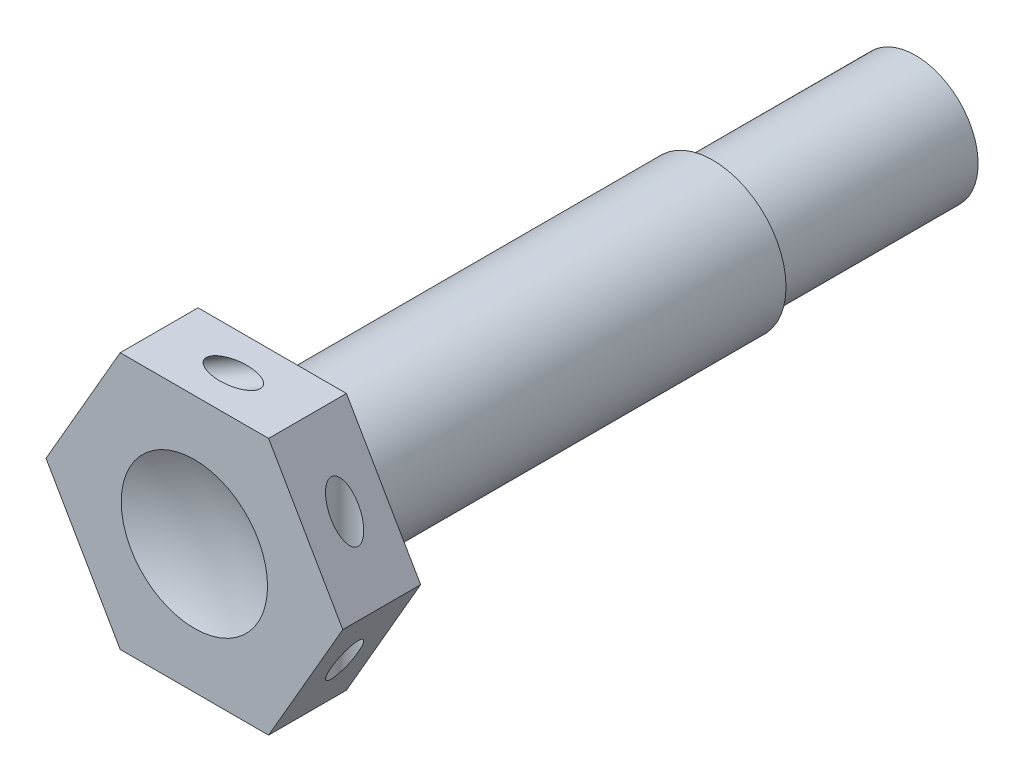
ISO-10303-21;
HEADER;
FILE_DESCRIPTION(('STEP AP214'),'2;1');
FILE_NAME('part.step','',(''),(''),'','','');
FILE_SCHEMA(('AUTOMOTIVE_DESIGN { 1 0 10303 214 1 1 1 1 }'));
ENDSEC;
DATA;
#1=APPLICATION_CONTEXT('core data for automotive mechanical design processes');
#2=APPLICATION_PROTOCOL_DEFINITION('international standard','automotive_design',2000,#1);
#3=PRODUCT_CONTEXT('',#1,'mechanical');
#4=PRODUCT('Part','Part','',(#3));
#5=PRODUCT_RELATED_PRODUCT_CATEGORY('part','',(#4));
#6=PRODUCT_DEFINITION_FORMATION('','',#4);
#7=PRODUCT_DEFINITION_CONTEXT('part definition',#1,'design');
#8=PRODUCT_DEFINITION('design','',#6,#7);
#9=PRODUCT_DEFINITION_SHAPE('','',#8);
#10=(LENGTH_UNIT() NAMED_UNIT(*) SI_UNIT(.MILLI.,.METRE.));
#11=(NAMED_UNIT(*) PLANE_ANGLE_UNIT() SI_UNIT($,.RADIAN.));
#12=(NAMED_UNIT(*) SI_UNIT($,.STERADIAN.) SOLID_ANGLE_UNIT());
#13=UNCERTAINTY_MEASURE_WITH_UNIT(LENGTH_MEASURE(1.E-05),#10,'distance_accuracy_value','');
#14=(GEOMETRIC_REPRESENTATION_CONTEXT(3) GLOBAL_UNCERTAINTY_ASSIGNED_CONTEXT((#13)) GLOBAL_UNIT_ASSIGNED_CONTEXT((#10,
#11,#12)) REPRESENTATION_CONTEXT('',''));
#15=CARTESIAN_POINT('',(0.,0.,0.));
#16=DIRECTION('',(0.,0.,1.));
#17=DIRECTION('',(1.,0.,0.));
#18=AXIS2_PLACEMENT_3D('',#15,#16,#17);
#19=CARTESIAN_POINT('',(6.41580486636972,0.,3.3655));
#20=DIRECTION('',(-0.866025403784438,-0.5,0.));
#21=DIRECTION('',(0.5,-0.866025403784439,0.));
#22=AXIS2_PLACEMENT_3D('',#19,#20,#21);
#23=PLANE('',#22);
#24=CARTESIAN_POINT('',(4.81185364977729,2.778125,1.68275));
#25=DIRECTION('',(-0.866025403784438,-0.5,0.));
#26=DIRECTION('',(-0.5,0.866025403784439,0.));
#27=AXIS2_PLACEMENT_3D('',#24,#25,#26);
#28=ELLIPSE('',#27,1.1684,0.5842);
#29=CARTESIAN_POINT('',(4.22765364977729,3.78998908178174,1.68275));
#30=VERTEX_POINT('',#29);
#31=EDGE_CURVE('E143',#30,#30,#28,.T.);
#32=ORIENTED_EDGE('',*,*,#31,.T.);
#33=EDGE_LOOP('',(#32));
#34=FACE_BOUND('',#33,.T.);
#35=DIRECTION('',(-0.5,0.866025403784438,0.));
#36=VECTOR('',#35,1.);
#37=CARTESIAN_POINT('',(6.41580486636972,0.,0.));
#38=LINE('',#37,#36);
#39=CARTESIAN_POINT('',(6.41580486636972,0.,0.));
#40=VERTEX_POINT('',#39);
#41=CARTESIAN_POINT('',(3.20790243318486,5.55625,0.));
#42=VERTEX_POINT('',#41);
#43=EDGE_CURVE('E122',#40,#42,#38,.T.);
#44=ORIENTED_EDGE('',*,*,#43,.T.);
#45=DIRECTION('',(0.,0.,-1.));
#46=VECTOR('',#45,1.);
#47=CARTESIAN_POINT('',(3.20790243318486,5.55625,3.3655));
#48=LINE('',#47,#46);
#49=CARTESIAN_POINT('',(3.20790243318486,5.55625,3.3655));
#50=VERTEX_POINT('',#49);
#51=EDGE_CURVE('E44',#50,#42,#48,.T.);
#52=ORIENTED_EDGE('',*,*,#51,.F.);
#53=DIRECTION('',(-0.5,0.866025403784438,0.));
#54=VECTOR('',#53,1.);
#55=CARTESIAN_POINT('',(6.41580486636972,0.,3.3655));
#56=LINE('',#55,#54);
#57=CARTESIAN_POINT('',(6.41580486636972,0.,3.3655));
#58=VERTEX_POINT('',#57);
#59=EDGE_CURVE('E133',#58,#50,#56,.T.);
#60=ORIENTED_EDGE('',*,*,#59,.F.);
#61=DIRECTION('',(0.,0.,-1.));
#62=VECTOR('',#61,1.);
#63=CARTESIAN_POINT('',(6.41580486636972,0.,3.3655));
#64=LINE('',#63,#62);
#65=EDGE_CURVE('E118',#58,#40,#64,.T.);
#66=ORIENTED_EDGE('',*,*,#65,.T.);
#67=EDGE_LOOP('',(#44,#52,#60,#66));
#68=FACE_BOUND('',#67,.T.);
#69=ADVANCED_FACE('F35',(#34,#68),#23,.F.);
#70=CARTESIAN_POINT('',(3.20790243318486,5.55625,3.3655));
#71=DIRECTION('',(0.,-1.,0.));
#72=DIRECTION('',(0.,0.,-1.));
#73=AXIS2_PLACEMENT_3D('',#70,#71,#72);
#74=PLANE('',#73);
#75=CARTESIAN_POINT('',(0.,5.55625,1.68275));
#76=DIRECTION('',(0.,-1.,0.));
#77=DIRECTION('',(-1.,0.,0.));
#78=AXIS2_PLACEMENT_3D('',#75,#76,#77);
#79=ELLIPSE('',#78,1.16839999999999,0.5842);
#80=CARTESIAN_POINT('',(-1.16840000000001,5.55625,1.68275));
#81=VERTEX_POINT('',#80);
#82=EDGE_CURVE('E144',#81,#81,#79,.T.);
#83=ORIENTED_EDGE('',*,*,#82,.T.);
#84=EDGE_LOOP('',(#83));
#85=FACE_BOUND('',#84,.T.);
#86=DIRECTION('',(-1.,0.,0.));
#87=VECTOR('',#86,1.);
#88=CARTESIAN_POINT('',(3.20790243318486,5.55625,0.));
#89=LINE('',#88,#87);
#90=CARTESIAN_POINT('',(-3.20790243318486,5.55625,0.));
#91=VERTEX_POINT('',#90);
#92=EDGE_CURVE('E125',#42,#91,#89,.T.);
#93=ORIENTED_EDGE('',*,*,#92,.T.);
#94=DIRECTION('',(0.,0.,-1.));
#95=VECTOR('',#94,1.);
#96=CARTESIAN_POINT('',(-3.20790243318486,5.55625,3.3655));
#97=LINE('',#96,#95);
#98=CARTESIAN_POINT('',(-3.20790243318486,5.55625,3.3655));
#99=VERTEX_POINT('',#98);
#100=EDGE_CURVE('E137',#99,#91,#97,.T.);
#101=ORIENTED_EDGE('',*,*,#100,.F.);
#102=DIRECTION('',(-1.,0.,0.));
#103=VECTOR('',#102,1.);
#104=CARTESIAN_POINT('',(3.20790243318486,5.55625,3.3655));
#105=LINE('',#104,#103);
#106=EDGE_CURVE('E91',#50,#99,#105,.T.);
#107=ORIENTED_EDGE('',*,*,#106,.F.);
#108=ORIENTED_EDGE('',*,*,#51,.T.);
#109=EDGE_LOOP('',(#93,#101,#107,#108));
#110=FACE_BOUND('',#109,.T.);
#111=ADVANCED_FACE('F174',(#85,#110),#74,.F.);
#112=CARTESIAN_POINT('',(-3.20790243318486,5.55625,3.3655));
#113=DIRECTION('',(0.866025403784439,-0.499999999999999,0.));
#114=DIRECTION('',(0.499999999999999,0.866025403784439,0.));
#115=AXIS2_PLACEMENT_3D('',#112,#113,#114);
#116=PLANE('',#115);
#117=CARTESIAN_POINT('',(-4.8118536497773,2.77812499999997,1.68275));
#118=DIRECTION('',(0.866025403784439,-0.499999999999999,0.));
#119=DIRECTION('',(-0.499999999999999,-0.866025403784439,0.));
#120=AXIS2_PLACEMENT_3D('',#117,#118,#119);
#121=ELLIPSE('',#120,1.16840000000001,0.5842);
#122=CARTESIAN_POINT('',(-5.39605364977731,1.76626091821823,1.68275));
#123=VERTEX_POINT('',#122);
#124=EDGE_CURVE('E38',#123,#123,#121,.T.);
#125=ORIENTED_EDGE('',*,*,#124,.T.);
#126=EDGE_LOOP('',(#125));
#127=FACE_BOUND('',#126,.T.);
#128=DIRECTION('',(-0.499999999999999,-0.866025403784439,0.));
#129=VECTOR('',#128,1.);
#130=CARTESIAN_POINT('',(-3.20790243318486,5.55625,0.));
#131=LINE('',#130,#129);
#132=CARTESIAN_POINT('',(-6.41580486636972,0.,0.));
#133=VERTEX_POINT('',#132);
#134=EDGE_CURVE('E128',#91,#133,#131,.T.);
#135=ORIENTED_EDGE('',*,*,#134,.T.);
#136=DIRECTION('',(0.,0.,-1.));
#137=VECTOR('',#136,1.);
#138=CARTESIAN_POINT('',(-6.41580486636972,0.,3.3655));
#139=LINE('',#138,#137);
#140=CARTESIAN_POINT('',(-6.41580486636972,0.,3.3655));
#141=VERTEX_POINT('',#140);
#142=EDGE_CURVE('E113',#141,#133,#139,.T.);
#143=ORIENTED_EDGE('',*,*,#142,.F.);
#144=DIRECTION('',(-0.499999999999999,-0.866025403784439,0.));
#145=VECTOR('',#144,1.);
#146=CARTESIAN_POINT('',(-3.20790243318486,5.55625,3.3655));
#147=LINE('',#146,#145);
#148=EDGE_CURVE('E104',#99,#141,#147,.T.);
#149=ORIENTED_EDGE('',*,*,#148,.F.);
#150=ORIENTED_EDGE('',*,*,#100,.T.);
#151=EDGE_LOOP('',(#135,#143,#149,#150));
#152=FACE_BOUND('',#151,.T.);
#153=ADVANCED_FACE('F177',(#127,#152),#116,.F.);
#154=CARTESIAN_POINT('',(-6.41580486636972,0.,3.3655));
#155=DIRECTION('',(0.866025403784438,0.5,0.));
#156=DIRECTION('',(-0.5,0.866025403784438,0.));
#157=AXIS2_PLACEMENT_3D('',#154,#155,#156);
#158=PLANE('',#157);
#159=CARTESIAN_POINT('',(-4.81185364977726,-2.77812500000004,1.68275));
#160=DIRECTION('',(0.866025403784438,0.5,0.));
#161=DIRECTION('',(0.5,-0.866025403784438,0.));
#162=AXIS2_PLACEMENT_3D('',#159,#160,#161);
#163=ELLIPSE('',#162,1.16839999999998,0.5842);
#164=CARTESIAN_POINT('',(-4.22765364977727,-3.78998908178176,1.68275));
#165=VERTEX_POINT('',#164);
#166=EDGE_CURVE('E147',#165,#165,#163,.T.);
#167=ORIENTED_EDGE('',*,*,#166,.T.);
#168=EDGE_LOOP('',(#167));
#169=FACE_BOUND('',#168,.T.);
#170=DIRECTION('',(0.5,-0.866025403784438,0.));
#171=VECTOR('',#170,1.);
#172=CARTESIAN_POINT('',(-6.41580486636972,0.,0.));
#173=LINE('',#172,#171);
#174=CARTESIAN_POINT('',(-3.20790243318486,-5.55625,0.));
#175=VERTEX_POINT('',#174);
#176=EDGE_CURVE('E112',#133,#175,#173,.T.);
#177=ORIENTED_EDGE('',*,*,#176,.T.);
#178=DIRECTION('',(0.,0.,-1.));
#179=VECTOR('',#178,1.);
#180=CARTESIAN_POINT('',(-3.20790243318486,-5.55625,3.3655));
#181=LINE('',#180,#179);
#182=CARTESIAN_POINT('',(-3.20790243318486,-5.55625,3.3655));
#183=VERTEX_POINT('',#182);
#184=EDGE_CURVE('E109',#183,#175,#181,.T.);
#185=ORIENTED_EDGE('',*,*,#184,.F.);
#186=DIRECTION('',(0.5,-0.866025403784438,0.));
#187=VECTOR('',#186,1.);
#188=CARTESIAN_POINT('',(-6.41580486636972,0.,3.3655));
#189=LINE('',#188,#187);
#190=EDGE_CURVE('E98',#141,#183,#189,.T.);
#191=ORIENTED_EDGE('',*,*,#190,.F.);
#192=ORIENTED_EDGE('',*,*,#142,.T.);
#193=EDGE_LOOP('',(#177,#185,#191,#192));
#194=FACE_BOUND('',#193,.T.);
#195=ADVANCED_FACE('F110',(#169,#194),#158,.F.);
#196=CARTESIAN_POINT('',(-3.20790243318486,-5.55625,3.3655));
#197=DIRECTION('',(0.,1.,0.));
#198=DIRECTION('',(-1.,0.,0.));
#199=AXIS2_PLACEMENT_3D('',#196,#197,#198);
#200=PLANE('',#199);
#201=CARTESIAN_POINT('',(0.,-5.55625,1.68275));
#202=DIRECTION('',(0.,1.,0.));
#203=DIRECTION('',(1.,0.,0.));
#204=AXIS2_PLACEMENT_3D('',#201,#202,#203);
#205=ELLIPSE('',#204,1.16840000000002,0.5842);
#206=CARTESIAN_POINT('',(1.16840000000008,-5.55625,1.68275));
#207=VERTEX_POINT('',#206);
#208=EDGE_CURVE('E145',#207,#207,#205,.T.);
#209=ORIENTED_EDGE('',*,*,#208,.T.);
#210=EDGE_LOOP('',(#209));
#211=FACE_BOUND('',#210,.T.);
#212=DIRECTION('',(1.,0.,0.));
#213=VECTOR('',#212,1.);
#214=CARTESIAN_POINT('',(-3.20790243318486,-5.55625,0.));
#215=LINE('',#214,#213);
#216=CARTESIAN_POINT('',(3.20790243318486,-5.55625,0.));
#217=VERTEX_POINT('',#216);
#218=EDGE_CURVE('E76',#175,#217,#215,.T.);
#219=ORIENTED_EDGE('',*,*,#218,.T.);
#220=DIRECTION('',(0.,0.,-1.));
#221=VECTOR('',#220,1.);
#222=CARTESIAN_POINT('',(3.20790243318486,-5.55625,3.3655));
#223=LINE('',#222,#221);
#224=CARTESIAN_POINT('',(3.20790243318486,-5.55625,3.3655));
#225=VERTEX_POINT('',#224);
#226=EDGE_CURVE('E114',#225,#217,#223,.T.);
#227=ORIENTED_EDGE('',*,*,#226,.F.);
#228=DIRECTION('',(1.,0.,0.));
#229=VECTOR('',#228,1.);
#230=CARTESIAN_POINT('',(-3.20790243318486,-5.55625,3.3655));
#231=LINE('',#230,#229);
#232=EDGE_CURVE('E102',#183,#225,#231,.T.);
#233=ORIENTED_EDGE('',*,*,#232,.F.);
#234=ORIENTED_EDGE('',*,*,#184,.T.);
#235=EDGE_LOOP('',(#219,#227,#233,#234));
#236=FACE_BOUND('',#235,.T.);
#237=ADVANCED_FACE('F116',(#211,#236),#200,.F.);
#238=CARTESIAN_POINT('',(3.20790243318486,-5.55625,3.3655));
#239=DIRECTION('',(-0.866025403784439,0.5,0.));
#240=DIRECTION('',(-0.5,-0.866025403784439,0.));
#241=AXIS2_PLACEMENT_3D('',#238,#239,#240);
#242=PLANE('',#241);
#243=CARTESIAN_POINT('',(4.81185364977729,-2.778125,1.68275));
#244=DIRECTION('',(-0.866025403784439,0.5,0.));
#245=DIRECTION('',(0.5,0.866025403784439,0.));
#246=AXIS2_PLACEMENT_3D('',#243,#244,#245);
#247=ELLIPSE('',#246,1.1684,0.5842);
#248=CARTESIAN_POINT('',(5.39605364977729,-1.76626091821826,1.68275));
#249=VERTEX_POINT('',#248);
#250=EDGE_CURVE('E141',#249,#249,#247,.T.);
#251=ORIENTED_EDGE('',*,*,#250,.T.);
#252=EDGE_LOOP('',(#251));
#253=FACE_BOUND('',#252,.T.);
#254=DIRECTION('',(0.5,0.866025403784439,0.));
#255=VECTOR('',#254,1.);
#256=CARTESIAN_POINT('',(3.20790243318486,-5.55625,0.));
#257=LINE('',#256,#255);
#258=EDGE_CURVE('E82',#217,#40,#257,.T.);
#259=ORIENTED_EDGE('',*,*,#258,.T.);
#260=ORIENTED_EDGE('',*,*,#65,.F.);
#261=DIRECTION('',(0.5,0.866025403784439,0.));
#262=VECTOR('',#261,1.);
#263=CARTESIAN_POINT('',(3.20790243318486,-5.55625,3.3655));
#264=LINE('',#263,#262);
#265=EDGE_CURVE('E53',#225,#58,#264,.T.);
#266=ORIENTED_EDGE('',*,*,#265,.F.);
#267=ORIENTED_EDGE('',*,*,#226,.T.);
#268=EDGE_LOOP('',(#259,#260,#266,#267));
#269=FACE_BOUND('',#268,.T.);
#270=ADVANCED_FACE('F182',(#253,#269),#242,.F.);
#271=CARTESIAN_POINT('',(0.,0.,3.3655));
#272=DIRECTION('',(0.,0.,1.));
#273=DIRECTION('',(1.,0.,0.));
#274=AXIS2_PLACEMENT_3D('',#271,#272,#273);
#275=PLANE('',#274);
#276=CARTESIAN_POINT('',(0.,0.,3.3655));
#277=DIRECTION('',(0.,0.,1.));
#278=DIRECTION('',(0.,-1.,0.));
#279=AXIS2_PLACEMENT_3D('',#276,#277,#278);
#280=CIRCLE('',#279,3.1623);
#281=CARTESIAN_POINT('',(0.,-3.1623,3.3655));
#282=VERTEX_POINT('',#281);
#283=EDGE_CURVE('E160',#282,#282,#280,.T.);
#284=ORIENTED_EDGE('',*,*,#283,.F.);
#285=EDGE_LOOP('',(#284));
#286=FACE_BOUND('',#285,.T.);
#287=ORIENTED_EDGE('',*,*,#59,.T.);
#288=ORIENTED_EDGE('',*,*,#106,.T.);
#289=ORIENTED_EDGE('',*,*,#148,.T.);
#290=ORIENTED_EDGE('',*,*,#190,.T.);
#291=ORIENTED_EDGE('',*,*,#232,.T.);
#292=ORIENTED_EDGE('',*,*,#265,.T.);
#293=EDGE_LOOP('',(#287,#288,#289,#290,#291,#292));
#294=FACE_BOUND('',#293,.T.);
#295=ADVANCED_FACE('F100',(#286,#294),#275,.T.);
#296=CARTESIAN_POINT('',(0.,0.,0.));
#297=DIRECTION('',(0.,0.,1.));
#298=DIRECTION('',(1.,0.,0.));
#299=AXIS2_PLACEMENT_3D('',#296,#297,#298);
#300=PLANE('',#299);
#301=CARTESIAN_POINT('',(0.,0.,0.));
#302=DIRECTION('',(0.,0.,1.));
#303=DIRECTION('',(1.,0.,0.));
#304=AXIS2_PLACEMENT_3D('',#301,#302,#303);
#305=CIRCLE('',#304,3.1623);
#306=CARTESIAN_POINT('',(3.1623,0.,0.));
#307=VERTEX_POINT('',#306);
#308=EDGE_CURVE('E11',#307,#307,#305,.F.);
#309=ORIENTED_EDGE('',*,*,#308,.F.);
#310=EDGE_LOOP('',(#309));
#311=FACE_BOUND('',#310,.T.);
#312=ORIENTED_EDGE('',*,*,#43,.F.);
#313=ORIENTED_EDGE('',*,*,#258,.F.);
#314=ORIENTED_EDGE('',*,*,#218,.F.);
#315=ORIENTED_EDGE('',*,*,#176,.F.);
#316=ORIENTED_EDGE('',*,*,#134,.F.);
#317=ORIENTED_EDGE('',*,*,#92,.F.);
#318=EDGE_LOOP('',(#312,#313,#314,#315,#316,#317));
#319=FACE_BOUND('',#318,.T.);
#320=ADVANCED_FACE('F180',(#311,#319),#300,.F.);
#321=CARTESIAN_POINT('',(0.,0.,-19.05));
#322=DIRECTION('',(0.,0.,1.));
#323=DIRECTION('',(1.,0.,0.));
#324=AXIS2_PLACEMENT_3D('',#321,#322,#323);
#325=CYLINDRICAL_SURFACE('',#324,3.1623);
#326=CARTESIAN_POINT('',(0.,0.,-19.05));
#327=DIRECTION('',(0.,0.,-1.));
#328=DIRECTION('',(-1.,0.,0.));
#329=AXIS2_PLACEMENT_3D('',#326,#327,#328);
#330=CIRCLE('',#329,3.1623);
#331=CARTESIAN_POINT('',(3.1623,0.,-19.05));
#332=VERTEX_POINT('',#331);
#333=EDGE_CURVE('E126',#332,#332,#330,.T.);
#334=CARTESIAN_POINT('',(3.1623,0.,-19.05));
#335=CARTESIAN_POINT('',(3.1623,0.,-18.8515625));
#336=CARTESIAN_POINT('',(3.1623,0.,-18.653125));
#337=CARTESIAN_POINT('',(3.1623,0.,-18.25625));
#338=CARTESIAN_POINT('',(3.1623,0.,-18.0578125));
#339=CARTESIAN_POINT('',(3.1623,0.,-17.6609375));
#340=CARTESIAN_POINT('',(3.1623,0.,-17.4625));
#341=CARTESIAN_POINT('',(3.1623,0.,-17.065625));
#342=CARTESIAN_POINT('',(3.1623,0.,-16.8671875));
#343=CARTESIAN_POINT('',(3.1623,0.,-16.4703125));
#344=CARTESIAN_POINT('',(3.1623,0.,-16.271875));
#345=CARTESIAN_POINT('',(3.1623,0.,-15.875));
#346=CARTESIAN_POINT('',(3.1623,0.,-15.6765625));
#347=CARTESIAN_POINT('',(3.1623,0.,-15.2796875));
#348=CARTESIAN_POINT('',(3.1623,0.,-15.08125));
#349=CARTESIAN_POINT('',(3.1623,0.,-14.684375));
#350=CARTESIAN_POINT('',(3.1623,0.,-14.4859375));
#351=CARTESIAN_POINT('',(3.1623,0.,-14.0890625));
#352=CARTESIAN_POINT('',(3.1623,0.,-13.890625));
#353=CARTESIAN_POINT('',(3.1623,0.,-13.49375));
#354=CARTESIAN_POINT('',(3.1623,0.,-13.2953125));
#355=CARTESIAN_POINT('',(3.1623,0.,-12.8984375));
#356=CARTESIAN_POINT('',(3.1623,0.,-12.7));
#357=CARTESIAN_POINT('',(3.1623,0.,-12.303125));
#358=CARTESIAN_POINT('',(3.1623,0.,-12.1046875));
#359=CARTESIAN_POINT('',(3.1623,0.,-11.7078125));
#360=CARTESIAN_POINT('',(3.1623,0.,-11.509375));
#361=CARTESIAN_POINT('',(3.1623,0.,-11.1125));
#362=CARTESIAN_POINT('',(3.1623,0.,-10.9140625));
#363=CARTESIAN_POINT('',(3.1623,0.,-10.5171875));
#364=CARTESIAN_POINT('',(3.1623,0.,-10.31875));
#365=CARTESIAN_POINT('',(3.1623,0.,-9.921875));
#366=CARTESIAN_POINT('',(3.1623,0.,-9.7234375));
#367=CARTESIAN_POINT('',(3.1623,0.,-9.3265625));
#368=CARTESIAN_POINT('',(3.1623,0.,-9.128125));
#369=CARTESIAN_POINT('',(3.1623,0.,-8.73125));
#370=CARTESIAN_POINT('',(3.1623,0.,-8.5328125));
#371=CARTESIAN_POINT('',(3.1623,0.,-8.1359375));
#372=CARTESIAN_POINT('',(3.1623,0.,-7.9375));
#373=CARTESIAN_POINT('',(3.1623,0.,-7.540625));
#374=CARTESIAN_POINT('',(3.1623,0.,-7.3421875));
#375=CARTESIAN_POINT('',(3.1623,0.,-6.9453125));
#376=CARTESIAN_POINT('',(3.1623,0.,-6.746875));
#377=CARTESIAN_POINT('',(3.1623,0.,-6.35));
#378=CARTESIAN_POINT('',(3.1623,0.,-6.1515625));
#379=CARTESIAN_POINT('',(3.1623,0.,-5.7546875));
#380=CARTESIAN_POINT('',(3.1623,0.,-5.55625));
#381=CARTESIAN_POINT('',(3.1623,0.,-5.159375));
#382=CARTESIAN_POINT('',(3.1623,0.,-4.9609375));
#383=CARTESIAN_POINT('',(3.1623,0.,-4.5640625));
#384=CARTESIAN_POINT('',(3.1623,0.,-4.365625));
#385=CARTESIAN_POINT('',(3.1623,0.,-3.96875));
#386=CARTESIAN_POINT('',(3.1623,0.,-3.7703125));
#387=CARTESIAN_POINT('',(3.1623,0.,-3.3734375));
#388=CARTESIAN_POINT('',(3.1623,0.,-3.175));
#389=CARTESIAN_POINT('',(3.1623,0.,-2.778125));
#390=CARTESIAN_POINT('',(3.1623,0.,-2.5796875));
#391=CARTESIAN_POINT('',(3.1623,0.,-2.1828125));
#392=CARTESIAN_POINT('',(3.1623,0.,-1.984375));
#393=CARTESIAN_POINT('',(3.1623,0.,-1.5875));
#394=CARTESIAN_POINT('',(3.1623,0.,-1.3890625));
#395=CARTESIAN_POINT('',(3.1623,0.,-0.992187500000001));
#396=CARTESIAN_POINT('',(3.1623,0.,-0.793750000000001));
#397=CARTESIAN_POINT('',(3.1623,0.,-0.396875));
#398=CARTESIAN_POINT('',(3.1623,0.,-0.1984375));
#399=CARTESIAN_POINT('',(3.1623,0.,0.));
#400=B_SPLINE_CURVE_WITH_KNOTS('',3,(#334,#335,#336,#337,#338,#339,#340,#341,#342,#343,#344,
#345,#346,#347,#348,#349,#350,#351,#352,#353,#354,#355,#356,#357,#358,#359,#360,#361,#362,#363,
#364,#365,#366,#367,#368,#369,#370,#371,#372,#373,#374,#375,#376,#377,#378,#379,#380,#381,#382,
#383,#384,#385,#386,#387,#388,#389,#390,#391,#392,#393,#394,#395,#396,#397,#398,#399),
.UNSPECIFIED.,.F.,.F.,(4,2,2,2,2,2,2,2,2,2,2,2,2,2,2,2,2,2,2,2,2,2,2,2,2,2,2,2,2,2,2,2,4),(0.,
0.595312499999997,1.190625,1.7859375,2.38125,2.9765625,3.571875,4.1671875,4.7625,5.3578125,
5.953125,6.5484375,7.14375,7.7390625,8.334375,8.9296875,9.525,10.1203125,10.715625,11.3109375,
11.90625,12.5015625,13.096875,13.6921875,14.2875,14.8828125,15.478125,16.0734375,16.66875,
17.2640625,17.859375,18.4546875,19.05),.UNSPECIFIED.);
#401=EDGE_CURVE('BSEAM231',#332,#307,#400,.T.);
#402=ORIENTED_EDGE('',*,*,#333,.F.);
#403=ORIENTED_EDGE('',*,*,#308,.T.);
#404=ORIENTED_EDGE('',*,*,#401,.T.);
#405=ORIENTED_EDGE('',*,*,#401,.F.);
#406=EDGE_LOOP('',(#402,#404,#403,#405));
#407=FACE_BOUND('',#406,.T.);
#408=ADVANCED_FACE('F231',(#407),#325,.T.);
#409=CARTESIAN_POINT('',(0.,0.,-19.05));
#410=DIRECTION('',(0.,0.,-1.));
#411=DIRECTION('',(-1.,0.,0.));
#412=AXIS2_PLACEMENT_3D('',#409,#410,#411);
#413=PLANE('',#412);
#414=CARTESIAN_POINT('',(0.,0.,-19.05));
#415=DIRECTION('',(0.,0.,-1.));
#416=DIRECTION('',(-1.,0.,0.));
#417=AXIS2_PLACEMENT_3D('',#414,#415,#416);
#418=CIRCLE('',#417,2.7051);
#419=CARTESIAN_POINT('',(-2.7051,0.,-19.05));
#420=VERTEX_POINT('',#419);
#421=EDGE_CURVE('E163',#420,#420,#418,.T.);
#422=ORIENTED_EDGE('',*,*,#421,.F.);
#423=EDGE_LOOP('',(#422));
#424=FACE_BOUND('',#423,.T.);
#425=ORIENTED_EDGE('',*,*,#333,.T.);
#426=EDGE_LOOP('',(#425));
#427=FACE_BOUND('',#426,.T.);
#428=ADVANCED_FACE('F227',(#424,#427),#413,.T.);
#429=CARTESIAN_POINT('',(0.,0.,-27.813));
#430=DIRECTION('',(0.,0.,1.));
#431=DIRECTION('',(1.,0.,0.));
#432=AXIS2_PLACEMENT_3D('',#429,#430,#431);
#433=CYLINDRICAL_SURFACE('',#432,2.7051);
#434=CARTESIAN_POINT('',(0.,0.,-27.813));
#435=DIRECTION('',(0.,0.,-1.));
#436=DIRECTION('',(-1.,0.,0.));
#437=AXIS2_PLACEMENT_3D('',#434,#435,#436);
#438=CIRCLE('',#437,2.7051);
#439=CARTESIAN_POINT('',(-2.7051,0.,-27.813));
#440=VERTEX_POINT('',#439);
#441=EDGE_CURVE('E164',#440,#440,#438,.T.);
#442=ORIENTED_EDGE('',*,*,#441,.F.);
#443=EDGE_LOOP('',(#442));
#444=FACE_BOUND('',#443,.T.);
#445=ORIENTED_EDGE('',*,*,#421,.T.);
#446=EDGE_LOOP('',(#445));
#447=FACE_BOUND('',#446,.T.);
#448=ADVANCED_FACE('F223',(#444,#447),#433,.T.);
#449=CARTESIAN_POINT('',(0.,0.,-27.813));
#450=DIRECTION('',(0.,0.,-1.));
#451=DIRECTION('',(-1.,0.,0.));
#452=AXIS2_PLACEMENT_3D('',#449,#450,#451);
#453=PLANE('',#452);
#454=ORIENTED_EDGE('',*,*,#441,.T.);
#455=EDGE_LOOP('',(#454));
#456=FACE_BOUND('',#455,.T.);
#457=ADVANCED_FACE('F215',(#456),#453,.T.);
#458=CARTESIAN_POINT('',(0.,0.,10.1470742347274));
#459=DIRECTION('',(0.,0.,1.));
#460=DIRECTION('',(0.,1.,0.));
#461=AXIS2_PLACEMENT_3D('',#458,#459,#460);
#462=SPHERICAL_SURFACE('',#461,7.48263926640312);
#463=ORIENTED_EDGE('',*,*,#283,.T.);
#464=EDGE_LOOP('',(#463));
#465=FACE_BOUND('',#464,.T.);
#466=ADVANCED_FACE('F205',(#465),#462,.F.);
#467=CARTESIAN_POINT('',(4.81185364977729,-5.55625,1.68275));
#468=DIRECTION('',(0.,1.,0.));
#469=DIRECTION('',(0.,0.,1.));
#470=AXIS2_PLACEMENT_3D('',#467,#468,#469);
#471=CYLINDRICAL_SURFACE('',#470,0.5842);
#472=ORIENTED_EDGE('',*,*,#250,.F.);
#473=EDGE_LOOP('',(#472));
#474=FACE_BOUND('',#473,.T.);
#475=ORIENTED_EDGE('',*,*,#31,.F.);
#476=EDGE_LOOP('',(#475));
#477=FACE_BOUND('',#476,.T.);
#478=ADVANCED_FACE('F202',(#474,#477),#471,.F.);
#479=CARTESIAN_POINT('',(-9.62370729955456,0.,1.68275));
#480=DIRECTION('',(0.866025403784443,-0.499999999999992,0.));
#481=DIRECTION('',(0.499999999999992,0.866025403784443,0.));
#482=AXIS2_PLACEMENT_3D('',#479,#480,#481);
#483=CYLINDRICAL_SURFACE('',#482,0.5842);
#484=ORIENTED_EDGE('',*,*,#208,.F.);
#485=EDGE_LOOP('',(#484));
#486=FACE_BOUND('',#485,.T.);
#487=ORIENTED_EDGE('',*,*,#166,.F.);
#488=EDGE_LOOP('',(#487));
#489=FACE_BOUND('',#488,.T.);
#490=ADVANCED_FACE('F204',(#486,#489),#483,.F.);
#491=CARTESIAN_POINT('',(4.81185364977725,8.33437500000002,1.68275));
#492=DIRECTION('',(-0.866025403784436,-0.500000000000004,0.));
#493=DIRECTION('',(0.500000000000004,-0.866025403784436,0.));
#494=AXIS2_PLACEMENT_3D('',#491,#492,#493);
#495=CYLINDRICAL_SURFACE('',#494,0.5842);
#496=ORIENTED_EDGE('',*,*,#124,.F.);
#497=EDGE_LOOP('',(#496));
#498=FACE_BOUND('',#497,.T.);
#499=ORIENTED_EDGE('',*,*,#82,.F.);
#500=EDGE_LOOP('',(#499));
#501=FACE_BOUND('',#500,.T.);
#502=ADVANCED_FACE('F212',(#498,#501),#495,.F.);
#503=CLOSED_SHELL('',(#69,#111,#153,#195,#237,#270,#295,#320,#408,#428,#448,#457,#466,#478,#490,#502));
#504=MANIFOLD_SOLID_BREP('B2',#503);
#505=ADVANCED_BREP_SHAPE_REPRESENTATION('',(#18,#504),#14);
#506=SHAPE_DEFINITION_REPRESENTATION(#9,#505);
ENDSEC;
END-ISO-10303-21;
